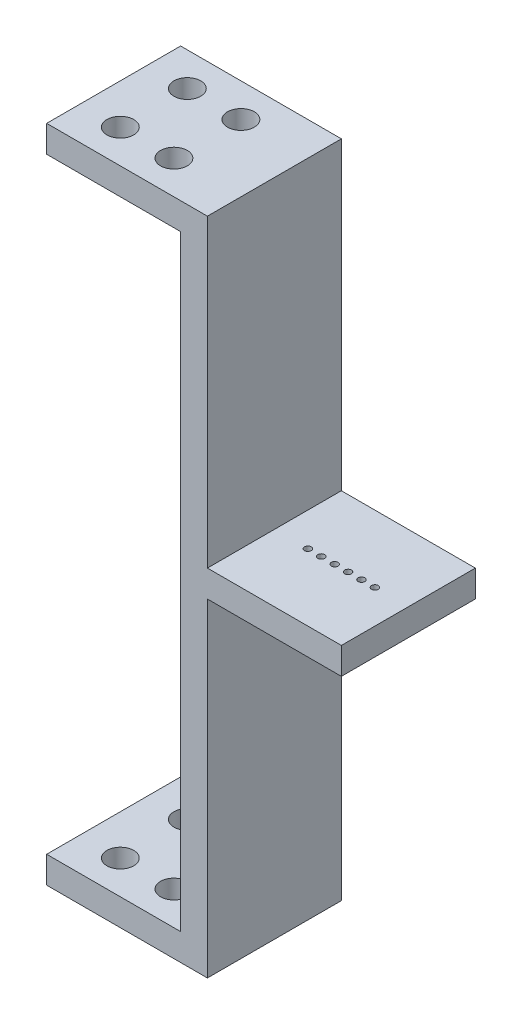
ISO-10303-21;
HEADER;
FILE_DESCRIPTION(('STEP AP214'),'2;1');
FILE_NAME('part.step','',(''),(''),'','','');
FILE_SCHEMA(('AUTOMOTIVE_DESIGN { 1 0 10303 214 1 1 1 1 }'));
ENDSEC;
DATA;
#1=APPLICATION_CONTEXT('core data for automotive mechanical design processes');
#2=APPLICATION_PROTOCOL_DEFINITION('international standard','automotive_design',2000,#1);
#3=PRODUCT_CONTEXT('',#1,'mechanical');
#4=PRODUCT('Part','Part','',(#3));
#5=PRODUCT_RELATED_PRODUCT_CATEGORY('part','',(#4));
#6=PRODUCT_DEFINITION_FORMATION('','',#4);
#7=PRODUCT_DEFINITION_CONTEXT('part definition',#1,'design');
#8=PRODUCT_DEFINITION('design','',#6,#7);
#9=PRODUCT_DEFINITION_SHAPE('','',#8);
#10=(LENGTH_UNIT() NAMED_UNIT(*) SI_UNIT(.MILLI.,.METRE.));
#11=(NAMED_UNIT(*) PLANE_ANGLE_UNIT() SI_UNIT($,.RADIAN.));
#12=(NAMED_UNIT(*) SI_UNIT($,.STERADIAN.) SOLID_ANGLE_UNIT());
#13=UNCERTAINTY_MEASURE_WITH_UNIT(LENGTH_MEASURE(1.E-05),#10,'distance_accuracy_value','');
#14=(GEOMETRIC_REPRESENTATION_CONTEXT(3) GLOBAL_UNCERTAINTY_ASSIGNED_CONTEXT((#13)) GLOBAL_UNIT_ASSIGNED_CONTEXT((#10,
#11,#12)) REPRESENTATION_CONTEXT('',''));
#15=CARTESIAN_POINT('',(0.,0.,0.));
#16=DIRECTION('',(0.,0.,1.));
#17=DIRECTION('',(1.,0.,0.));
#18=AXIS2_PLACEMENT_3D('',#15,#16,#17);
#19=CARTESIAN_POINT('',(-24.,49.25,20.));
#20=DIRECTION('',(1.,0.,0.));
#21=DIRECTION('',(0.,0.,-1.));
#22=AXIS2_PLACEMENT_3D('',#19,#20,#21);
#23=PLANE('',#22);
#24=DIRECTION('',(0.,-1.,0.));
#25=VECTOR('',#24,1.);
#26=CARTESIAN_POINT('',(-24.,49.25,0.));
#27=LINE('',#26,#25);
#28=CARTESIAN_POINT('',(-24.,49.25,0.));
#29=VERTEX_POINT('',#28);
#30=CARTESIAN_POINT('',(-24.,45.25,0.));
#31=VERTEX_POINT('',#30);
#32=EDGE_CURVE('E153',#29,#31,#27,.T.);
#33=ORIENTED_EDGE('',*,*,#32,.T.);
#34=DIRECTION('',(0.,0.,-1.));
#35=VECTOR('',#34,1.);
#36=CARTESIAN_POINT('',(-24.,45.25,20.));
#37=LINE('',#36,#35);
#38=CARTESIAN_POINT('',(-24.,45.25,20.));
#39=VERTEX_POINT('',#38);
#40=EDGE_CURVE('E11',#39,#31,#37,.T.);
#41=ORIENTED_EDGE('',*,*,#40,.F.);
#42=DIRECTION('',(0.,-1.,0.));
#43=VECTOR('',#42,1.);
#44=CARTESIAN_POINT('',(-24.,49.25,20.));
#45=LINE('',#44,#43);
#46=CARTESIAN_POINT('',(-24.,49.25,20.));
#47=VERTEX_POINT('',#46);
#48=EDGE_CURVE('E176',#47,#39,#45,.T.);
#49=ORIENTED_EDGE('',*,*,#48,.F.);
#50=DIRECTION('',(0.,0.,-1.));
#51=VECTOR('',#50,1.);
#52=CARTESIAN_POINT('',(-24.,49.25,20.));
#53=LINE('',#52,#51);
#54=EDGE_CURVE('E149',#47,#29,#53,.T.);
#55=ORIENTED_EDGE('',*,*,#54,.T.);
#56=EDGE_LOOP('',(#33,#41,#49,#55));
#57=FACE_BOUND('',#56,.T.);
#58=ADVANCED_FACE('F33',(#57),#23,.F.);
#59=CARTESIAN_POINT('',(-24.,45.25,20.));
#60=DIRECTION('',(0.,1.,0.));
#61=DIRECTION('',(0.,0.,1.));
#62=AXIS2_PLACEMENT_3D('',#59,#60,#61);
#63=PLANE('',#62);
#64=CARTESIAN_POINT('',(-18.,45.25,15.));
#65=DIRECTION('',(0.,1.,0.));
#66=DIRECTION('',(0.,0.,1.));
#67=AXIS2_PLACEMENT_3D('',#64,#65,#66);
#68=CIRCLE('',#67,2.);
#69=CARTESIAN_POINT('',(-18.,45.25,17.));
#70=VERTEX_POINT('',#69);
#71=EDGE_CURVE('E157',#70,#70,#68,.T.);
#72=ORIENTED_EDGE('',*,*,#71,.T.);
#73=EDGE_LOOP('',(#72));
#74=FACE_BOUND('',#73,.T.);
#75=CARTESIAN_POINT('',(-9.99999999999999,45.25,15.));
#76=DIRECTION('',(0.,1.,0.));
#77=DIRECTION('',(0.,0.,1.));
#78=AXIS2_PLACEMENT_3D('',#75,#76,#77);
#79=CIRCLE('',#78,2.);
#80=CARTESIAN_POINT('',(-9.99999999999999,45.25,17.));
#81=VERTEX_POINT('',#80);
#82=EDGE_CURVE('E376',#81,#81,#79,.T.);
#83=ORIENTED_EDGE('',*,*,#82,.T.);
#84=EDGE_LOOP('',(#83));
#85=FACE_BOUND('',#84,.T.);
#86=CARTESIAN_POINT('',(-9.99999999999999,45.25,5.));
#87=DIRECTION('',(0.,1.,0.));
#88=DIRECTION('',(0.,0.,1.));
#89=AXIS2_PLACEMENT_3D('',#86,#87,#88);
#90=CIRCLE('',#89,2.);
#91=CARTESIAN_POINT('',(-9.99999999999999,45.25,7.));
#92=VERTEX_POINT('',#91);
#93=EDGE_CURVE('E370',#92,#92,#90,.T.);
#94=ORIENTED_EDGE('',*,*,#93,.T.);
#95=EDGE_LOOP('',(#94));
#96=FACE_BOUND('',#95,.T.);
#97=CARTESIAN_POINT('',(-18.,45.25,5.));
#98=DIRECTION('',(0.,1.,0.));
#99=DIRECTION('',(0.,0.,1.));
#100=AXIS2_PLACEMENT_3D('',#97,#98,#99);
#101=CIRCLE('',#100,2.);
#102=CARTESIAN_POINT('',(-18.,45.25,7.));
#103=VERTEX_POINT('',#102);
#104=EDGE_CURVE('E364',#103,#103,#101,.T.);
#105=ORIENTED_EDGE('',*,*,#104,.T.);
#106=EDGE_LOOP('',(#105));
#107=FACE_BOUND('',#106,.T.);
#108=DIRECTION('',(1.,0.,0.));
#109=VECTOR('',#108,1.);
#110=CARTESIAN_POINT('',(-24.,45.25,0.));
#111=LINE('',#110,#109);
#112=CARTESIAN_POINT('',(-4.,45.25,0.));
#113=VERTEX_POINT('',#112);
#114=EDGE_CURVE('E156',#31,#113,#111,.T.);
#115=ORIENTED_EDGE('',*,*,#114,.T.);
#116=DIRECTION('',(0.,0.,-1.));
#117=VECTOR('',#116,1.);
#118=CARTESIAN_POINT('',(-4.,45.25,20.));
#119=LINE('',#118,#117);
#120=CARTESIAN_POINT('',(-4.,45.25,20.));
#121=VERTEX_POINT('',#120);
#122=EDGE_CURVE('E41',#121,#113,#119,.T.);
#123=ORIENTED_EDGE('',*,*,#122,.F.);
#124=DIRECTION('',(1.,0.,0.));
#125=VECTOR('',#124,1.);
#126=CARTESIAN_POINT('',(-24.,45.25,20.));
#127=LINE('',#126,#125);
#128=EDGE_CURVE('E104',#39,#121,#127,.T.);
#129=ORIENTED_EDGE('',*,*,#128,.F.);
#130=ORIENTED_EDGE('',*,*,#40,.T.);
#131=EDGE_LOOP('',(#115,#123,#129,#130));
#132=FACE_BOUND('',#131,.T.);
#133=ADVANCED_FACE('F257',(#74,#85,#96,#107,#132),#63,.F.);
#134=CARTESIAN_POINT('',(-4.,45.25,20.));
#135=DIRECTION('',(1.,0.,0.));
#136=DIRECTION('',(0.,1.,0.));
#137=AXIS2_PLACEMENT_3D('',#134,#135,#136);
#138=PLANE('',#137);
#139=DIRECTION('',(0.,-1.,0.));
#140=VECTOR('',#139,1.);
#141=CARTESIAN_POINT('',(-4.,45.25,0.));
#142=LINE('',#141,#140);
#143=CARTESIAN_POINT('',(-3.99999999999999,-45.25,0.));
#144=VERTEX_POINT('',#143);
#145=EDGE_CURVE('E159',#113,#144,#142,.T.);
#146=ORIENTED_EDGE('',*,*,#145,.T.);
#147=DIRECTION('',(0.,0.,-1.));
#148=VECTOR('',#147,1.);
#149=CARTESIAN_POINT('',(-3.99999999999999,-45.25,20.));
#150=LINE('',#149,#148);
#151=CARTESIAN_POINT('',(-3.99999999999999,-45.25,20.));
#152=VERTEX_POINT('',#151);
#153=EDGE_CURVE('E195',#152,#144,#150,.T.);
#154=ORIENTED_EDGE('',*,*,#153,.F.);
#155=DIRECTION('',(0.,-1.,0.));
#156=VECTOR('',#155,1.);
#157=CARTESIAN_POINT('',(-4.,45.25,20.));
#158=LINE('',#157,#156);
#159=EDGE_CURVE('E203',#121,#152,#158,.T.);
#160=ORIENTED_EDGE('',*,*,#159,.F.);
#161=ORIENTED_EDGE('',*,*,#122,.T.);
#162=EDGE_LOOP('',(#146,#154,#160,#161));
#163=FACE_BOUND('',#162,.T.);
#164=ADVANCED_FACE('F201',(#163),#138,.F.);
#165=CARTESIAN_POINT('',(-3.99999999999999,-45.25,20.));
#166=DIRECTION('',(0.,-1.,0.));
#167=DIRECTION('',(0.,0.,-1.));
#168=AXIS2_PLACEMENT_3D('',#165,#166,#167);
#169=PLANE('',#168);
#170=CARTESIAN_POINT('',(-18.,-45.25,15.));
#171=DIRECTION('',(0.,-1.,0.));
#172=DIRECTION('',(0.,0.,-1.));
#173=AXIS2_PLACEMENT_3D('',#170,#171,#172);
#174=CIRCLE('',#173,2.);
#175=CARTESIAN_POINT('',(-18.,-45.25,13.));
#176=VERTEX_POINT('',#175);
#177=EDGE_CURVE('E379',#176,#176,#174,.T.);
#178=ORIENTED_EDGE('',*,*,#177,.T.);
#179=EDGE_LOOP('',(#178));
#180=FACE_BOUND('',#179,.T.);
#181=CARTESIAN_POINT('',(-9.99999999999999,-45.25,15.));
#182=DIRECTION('',(0.,-1.,0.));
#183=DIRECTION('',(0.,0.,-1.));
#184=AXIS2_PLACEMENT_3D('',#181,#182,#183);
#185=CIRCLE('',#184,2.);
#186=CARTESIAN_POINT('',(-9.99999999999999,-45.25,13.));
#187=VERTEX_POINT('',#186);
#188=EDGE_CURVE('E373',#187,#187,#185,.T.);
#189=ORIENTED_EDGE('',*,*,#188,.T.);
#190=EDGE_LOOP('',(#189));
#191=FACE_BOUND('',#190,.T.);
#192=CARTESIAN_POINT('',(-9.99999999999999,-45.25,5.));
#193=DIRECTION('',(0.,-1.,0.));
#194=DIRECTION('',(0.,0.,-1.));
#195=AXIS2_PLACEMENT_3D('',#192,#193,#194);
#196=CIRCLE('',#195,2.);
#197=CARTESIAN_POINT('',(-9.99999999999999,-45.25,3.));
#198=VERTEX_POINT('',#197);
#199=EDGE_CURVE('E367',#198,#198,#196,.T.);
#200=ORIENTED_EDGE('',*,*,#199,.T.);
#201=EDGE_LOOP('',(#200));
#202=FACE_BOUND('',#201,.T.);
#203=CARTESIAN_POINT('',(-18.,-45.25,5.));
#204=DIRECTION('',(0.,-1.,0.));
#205=DIRECTION('',(0.,0.,-1.));
#206=AXIS2_PLACEMENT_3D('',#203,#204,#205);
#207=CIRCLE('',#206,2.);
#208=CARTESIAN_POINT('',(-18.,-45.25,3.));
#209=VERTEX_POINT('',#208);
#210=EDGE_CURVE('E359',#209,#209,#207,.T.);
#211=ORIENTED_EDGE('',*,*,#210,.T.);
#212=EDGE_LOOP('',(#211));
#213=FACE_BOUND('',#212,.T.);
#214=DIRECTION('',(-1.,0.,0.));
#215=VECTOR('',#214,1.);
#216=CARTESIAN_POINT('',(-3.99999999999999,-45.25,0.));
#217=LINE('',#216,#215);
#218=CARTESIAN_POINT('',(-24.,-45.25,0.));
#219=VERTEX_POINT('',#218);
#220=EDGE_CURVE('E161',#144,#219,#217,.T.);
#221=ORIENTED_EDGE('',*,*,#220,.T.);
#222=DIRECTION('',(0.,0.,-1.));
#223=VECTOR('',#222,1.);
#224=CARTESIAN_POINT('',(-24.,-45.25,20.));
#225=LINE('',#224,#223);
#226=CARTESIAN_POINT('',(-24.,-45.25,20.));
#227=VERTEX_POINT('',#226);
#228=EDGE_CURVE('E192',#227,#219,#225,.T.);
#229=ORIENTED_EDGE('',*,*,#228,.F.);
#230=DIRECTION('',(-1.,0.,0.));
#231=VECTOR('',#230,1.);
#232=CARTESIAN_POINT('',(-3.99999999999999,-45.25,20.));
#233=LINE('',#232,#231);
#234=EDGE_CURVE('E221',#152,#227,#233,.T.);
#235=ORIENTED_EDGE('',*,*,#234,.F.);
#236=ORIENTED_EDGE('',*,*,#153,.T.);
#237=EDGE_LOOP('',(#221,#229,#235,#236));
#238=FACE_BOUND('',#237,.T.);
#239=ADVANCED_FACE('F212',(#180,#191,#202,#213,#238),#169,.F.);
#240=CARTESIAN_POINT('',(-24.,-49.25,20.));
#241=DIRECTION('',(1.,0.,0.));
#242=DIRECTION('',(0.,0.,-1.));
#243=AXIS2_PLACEMENT_3D('',#240,#241,#242);
#244=PLANE('',#243);
#245=DIRECTION('',(0.,-1.,0.));
#246=VECTOR('',#245,1.);
#247=CARTESIAN_POINT('',(-24.,-49.25,0.));
#248=LINE('',#247,#246);
#249=CARTESIAN_POINT('',(-24.,-49.25,0.));
#250=VERTEX_POINT('',#249);
#251=EDGE_CURVE('E163',#219,#250,#248,.T.);
#252=ORIENTED_EDGE('',*,*,#251,.T.);
#253=DIRECTION('',(0.,0.,-1.));
#254=VECTOR('',#253,1.);
#255=CARTESIAN_POINT('',(-24.,-49.25,20.));
#256=LINE('',#255,#254);
#257=CARTESIAN_POINT('',(-24.,-49.25,20.));
#258=VERTEX_POINT('',#257);
#259=EDGE_CURVE('E189',#258,#250,#256,.T.);
#260=ORIENTED_EDGE('',*,*,#259,.F.);
#261=DIRECTION('',(0.,-1.,0.));
#262=VECTOR('',#261,1.);
#263=CARTESIAN_POINT('',(-24.,-49.25,20.));
#264=LINE('',#263,#262);
#265=EDGE_CURVE('E218',#227,#258,#264,.T.);
#266=ORIENTED_EDGE('',*,*,#265,.F.);
#267=ORIENTED_EDGE('',*,*,#228,.T.);
#268=EDGE_LOOP('',(#252,#260,#266,#267));
#269=FACE_BOUND('',#268,.T.);
#270=ADVANCED_FACE('F216',(#269),#244,.F.);
#271=CARTESIAN_POINT('',(0.,-49.25,20.));
#272=DIRECTION('',(0.,1.,0.));
#273=DIRECTION('',(0.,0.,1.));
#274=AXIS2_PLACEMENT_3D('',#271,#272,#273);
#275=PLANE('',#274);
#276=CARTESIAN_POINT('',(-18.,-49.25,15.));
#277=DIRECTION('',(0.,1.,0.));
#278=DIRECTION('',(0.,0.,1.));
#279=AXIS2_PLACEMENT_3D('',#276,#277,#278);
#280=CIRCLE('',#279,2.);
#281=CARTESIAN_POINT('',(-18.,-49.25,17.));
#282=VERTEX_POINT('',#281);
#283=EDGE_CURVE('E337',#282,#282,#280,.T.);
#284=ORIENTED_EDGE('',*,*,#283,.T.);
#285=EDGE_LOOP('',(#284));
#286=FACE_BOUND('',#285,.T.);
#287=CARTESIAN_POINT('',(-9.99999999999999,-49.25,15.));
#288=DIRECTION('',(0.,1.,0.));
#289=DIRECTION('',(0.,0.,1.));
#290=AXIS2_PLACEMENT_3D('',#287,#288,#289);
#291=CIRCLE('',#290,2.);
#292=CARTESIAN_POINT('',(-9.99999999999999,-49.25,17.));
#293=VERTEX_POINT('',#292);
#294=EDGE_CURVE('E348',#293,#293,#291,.T.);
#295=ORIENTED_EDGE('',*,*,#294,.T.);
#296=EDGE_LOOP('',(#295));
#297=FACE_BOUND('',#296,.T.);
#298=CARTESIAN_POINT('',(-9.99999999999999,-49.25,5.));
#299=DIRECTION('',(0.,1.,0.));
#300=DIRECTION('',(0.,0.,1.));
#301=AXIS2_PLACEMENT_3D('',#298,#299,#300);
#302=CIRCLE('',#301,2.);
#303=CARTESIAN_POINT('',(-9.99999999999999,-49.25,7.));
#304=VERTEX_POINT('',#303);
#305=EDGE_CURVE('E342',#304,#304,#302,.T.);
#306=ORIENTED_EDGE('',*,*,#305,.T.);
#307=EDGE_LOOP('',(#306));
#308=FACE_BOUND('',#307,.T.);
#309=CARTESIAN_POINT('',(-18.,-49.25,5.));
#310=DIRECTION('',(0.,1.,0.));
#311=DIRECTION('',(0.,0.,1.));
#312=AXIS2_PLACEMENT_3D('',#309,#310,#311);
#313=CIRCLE('',#312,2.);
#314=CARTESIAN_POINT('',(-18.,-49.25,7.));
#315=VERTEX_POINT('',#314);
#316=EDGE_CURVE('E356',#315,#315,#313,.T.);
#317=ORIENTED_EDGE('',*,*,#316,.T.);
#318=EDGE_LOOP('',(#317));
#319=FACE_BOUND('',#318,.T.);
#320=DIRECTION('',(1.,0.,0.));
#321=VECTOR('',#320,1.);
#322=CARTESIAN_POINT('',(0.,-49.25,0.));
#323=LINE('',#322,#321);
#324=CARTESIAN_POINT('',(0.,-49.25,0.));
#325=VERTEX_POINT('',#324);
#326=EDGE_CURVE('E165',#250,#325,#323,.T.);
#327=ORIENTED_EDGE('',*,*,#326,.T.);
#328=DIRECTION('',(0.,0.,-1.));
#329=VECTOR('',#328,1.);
#330=CARTESIAN_POINT('',(0.,-49.25,20.));
#331=LINE('',#330,#329);
#332=CARTESIAN_POINT('',(0.,-49.25,20.));
#333=VERTEX_POINT('',#332);
#334=EDGE_CURVE('E186',#333,#325,#331,.T.);
#335=ORIENTED_EDGE('',*,*,#334,.F.);
#336=DIRECTION('',(1.,0.,0.));
#337=VECTOR('',#336,1.);
#338=CARTESIAN_POINT('',(0.,-49.25,20.));
#339=LINE('',#338,#337);
#340=EDGE_CURVE('E220',#258,#333,#339,.T.);
#341=ORIENTED_EDGE('',*,*,#340,.F.);
#342=ORIENTED_EDGE('',*,*,#259,.T.);
#343=EDGE_LOOP('',(#327,#335,#341,#342));
#344=FACE_BOUND('',#343,.T.);
#345=ADVANCED_FACE('F274',(#286,#297,#308,#319,#344),#275,.F.);
#346=CARTESIAN_POINT('',(0.,-0.25,20.));
#347=DIRECTION('',(-1.,0.,0.));
#348=DIRECTION('',(0.,-1.,0.));
#349=AXIS2_PLACEMENT_3D('',#346,#347,#348);
#350=PLANE('',#349);
#351=DIRECTION('',(0.,1.,0.));
#352=VECTOR('',#351,1.);
#353=CARTESIAN_POINT('',(0.,-0.25,0.));
#354=LINE('',#353,#352);
#355=CARTESIAN_POINT('',(0.,-0.25,0.));
#356=VERTEX_POINT('',#355);
#357=EDGE_CURVE('E167',#325,#356,#354,.T.);
#358=ORIENTED_EDGE('',*,*,#357,.T.);
#359=DIRECTION('',(0.,0.,-1.));
#360=VECTOR('',#359,1.);
#361=CARTESIAN_POINT('',(0.,-0.25,20.));
#362=LINE('',#361,#360);
#363=CARTESIAN_POINT('',(0.,-0.25,20.));
#364=VERTEX_POINT('',#363);
#365=EDGE_CURVE('E183',#364,#356,#362,.T.);
#366=ORIENTED_EDGE('',*,*,#365,.F.);
#367=DIRECTION('',(0.,1.,0.));
#368=VECTOR('',#367,1.);
#369=CARTESIAN_POINT('',(0.,-0.25,20.));
#370=LINE('',#369,#368);
#371=EDGE_CURVE('E223',#333,#364,#370,.T.);
#372=ORIENTED_EDGE('',*,*,#371,.F.);
#373=ORIENTED_EDGE('',*,*,#334,.T.);
#374=EDGE_LOOP('',(#358,#366,#372,#373));
#375=FACE_BOUND('',#374,.T.);
#376=ADVANCED_FACE('F277',(#375),#350,.F.);
#377=CARTESIAN_POINT('',(20.,-0.249999999999997,20.));
#378=DIRECTION('',(0.,1.,0.));
#379=DIRECTION('',(-1.,0.,0.));
#380=AXIS2_PLACEMENT_3D('',#377,#378,#379);
#381=PLANE('',#380);
#382=CARTESIAN_POINT('',(15.,-0.249999999999997,10.));
#383=DIRECTION('',(0.,1.,0.));
#384=DIRECTION('',(-1.,0.,0.));
#385=AXIS2_PLACEMENT_3D('',#382,#383,#384);
#386=CIRCLE('',#385,0.499999999999999);
#387=CARTESIAN_POINT('',(14.5,-0.249999999999997,10.));
#388=VERTEX_POINT('',#387);
#389=EDGE_CURVE('E334',#388,#388,#386,.T.);
#390=ORIENTED_EDGE('',*,*,#389,.T.);
#391=EDGE_LOOP('',(#390));
#392=FACE_BOUND('',#391,.T.);
#393=CARTESIAN_POINT('',(13.,-0.249999999999997,10.));
#394=DIRECTION('',(0.,1.,0.));
#395=DIRECTION('',(-1.,0.,0.));
#396=AXIS2_PLACEMENT_3D('',#393,#394,#395);
#397=CIRCLE('',#396,0.499999999999999);
#398=CARTESIAN_POINT('',(12.5,-0.249999999999997,10.));
#399=VERTEX_POINT('',#398);
#400=EDGE_CURVE('E331',#399,#399,#397,.T.);
#401=ORIENTED_EDGE('',*,*,#400,.T.);
#402=EDGE_LOOP('',(#401));
#403=FACE_BOUND('',#402,.T.);
#404=CARTESIAN_POINT('',(11.,-0.249999999999997,10.));
#405=DIRECTION('',(0.,1.,0.));
#406=DIRECTION('',(-1.,0.,0.));
#407=AXIS2_PLACEMENT_3D('',#404,#405,#406);
#408=CIRCLE('',#407,0.499999999999999);
#409=CARTESIAN_POINT('',(10.5,-0.249999999999997,10.));
#410=VERTEX_POINT('',#409);
#411=EDGE_CURVE('E328',#410,#410,#408,.T.);
#412=ORIENTED_EDGE('',*,*,#411,.T.);
#413=EDGE_LOOP('',(#412));
#414=FACE_BOUND('',#413,.T.);
#415=CARTESIAN_POINT('',(9.00000000000001,-0.249999999999997,10.));
#416=DIRECTION('',(0.,1.,0.));
#417=DIRECTION('',(-1.,0.,0.));
#418=AXIS2_PLACEMENT_3D('',#415,#416,#417);
#419=CIRCLE('',#418,0.499999999999999);
#420=CARTESIAN_POINT('',(8.50000000000001,-0.249999999999997,10.));
#421=VERTEX_POINT('',#420);
#422=EDGE_CURVE('E325',#421,#421,#419,.T.);
#423=ORIENTED_EDGE('',*,*,#422,.T.);
#424=EDGE_LOOP('',(#423));
#425=FACE_BOUND('',#424,.T.);
#426=CARTESIAN_POINT('',(7.00000000000001,-0.249999999999997,10.0000000000001));
#427=DIRECTION('',(0.,1.,0.));
#428=DIRECTION('',(-1.,0.,0.));
#429=AXIS2_PLACEMENT_3D('',#426,#427,#428);
#430=CIRCLE('',#429,0.499999999999999);
#431=CARTESIAN_POINT('',(6.50000000000001,-0.249999999999997,10.0000000000001));
#432=VERTEX_POINT('',#431);
#433=EDGE_CURVE('E322',#432,#432,#430,.T.);
#434=ORIENTED_EDGE('',*,*,#433,.T.);
#435=EDGE_LOOP('',(#434));
#436=FACE_BOUND('',#435,.T.);
#437=CARTESIAN_POINT('',(5.00000000000001,-0.25,10.0000000000001));
#438=DIRECTION('',(0.,1.,0.));
#439=DIRECTION('',(-1.,0.,0.));
#440=AXIS2_PLACEMENT_3D('',#437,#438,#439);
#441=CIRCLE('',#440,0.499999999999999);
#442=CARTESIAN_POINT('',(4.50000000000001,-0.25,10.0000000000001));
#443=VERTEX_POINT('',#442);
#444=EDGE_CURVE('E319',#443,#443,#441,.T.);
#445=ORIENTED_EDGE('',*,*,#444,.T.);
#446=EDGE_LOOP('',(#445));
#447=FACE_BOUND('',#446,.T.);
#448=DIRECTION('',(1.,0.,0.));
#449=VECTOR('',#448,1.);
#450=CARTESIAN_POINT('',(20.,-0.249999999999997,0.));
#451=LINE('',#450,#449);
#452=CARTESIAN_POINT('',(20.,-0.249999999999997,0.));
#453=VERTEX_POINT('',#452);
#454=EDGE_CURVE('E169',#356,#453,#451,.T.);
#455=ORIENTED_EDGE('',*,*,#454,.T.);
#456=DIRECTION('',(0.,0.,-1.));
#457=VECTOR('',#456,1.);
#458=CARTESIAN_POINT('',(20.,-0.249999999999997,20.));
#459=LINE('',#458,#457);
#460=CARTESIAN_POINT('',(20.,-0.249999999999997,20.));
#461=VERTEX_POINT('',#460);
#462=EDGE_CURVE('E180',#461,#453,#459,.T.);
#463=ORIENTED_EDGE('',*,*,#462,.F.);
#464=DIRECTION('',(1.,0.,0.));
#465=VECTOR('',#464,1.);
#466=CARTESIAN_POINT('',(20.,-0.249999999999997,20.));
#467=LINE('',#466,#465);
#468=EDGE_CURVE('E229',#364,#461,#467,.T.);
#469=ORIENTED_EDGE('',*,*,#468,.F.);
#470=ORIENTED_EDGE('',*,*,#365,.T.);
#471=EDGE_LOOP('',(#455,#463,#469,#470));
#472=FACE_BOUND('',#471,.T.);
#473=ADVANCED_FACE('F235',(#392,#403,#414,#425,#436,#447,#472),#381,.F.);
#474=CARTESIAN_POINT('',(20.,3.75,20.));
#475=DIRECTION('',(-1.,0.,0.));
#476=DIRECTION('',(0.,0.,1.));
#477=AXIS2_PLACEMENT_3D('',#474,#475,#476);
#478=PLANE('',#477);
#479=DIRECTION('',(0.,1.,0.));
#480=VECTOR('',#479,1.);
#481=CARTESIAN_POINT('',(20.,3.75,0.));
#482=LINE('',#481,#480);
#483=CARTESIAN_POINT('',(20.,3.75,0.));
#484=VERTEX_POINT('',#483);
#485=EDGE_CURVE('E171',#453,#484,#482,.T.);
#486=ORIENTED_EDGE('',*,*,#485,.T.);
#487=DIRECTION('',(0.,0.,-1.));
#488=VECTOR('',#487,1.);
#489=CARTESIAN_POINT('',(20.,3.75,20.));
#490=LINE('',#489,#488);
#491=CARTESIAN_POINT('',(20.,3.75,20.));
#492=VERTEX_POINT('',#491);
#493=EDGE_CURVE('E144',#492,#484,#490,.T.);
#494=ORIENTED_EDGE('',*,*,#493,.F.);
#495=DIRECTION('',(0.,1.,0.));
#496=VECTOR('',#495,1.);
#497=CARTESIAN_POINT('',(20.,3.75,20.));
#498=LINE('',#497,#496);
#499=EDGE_CURVE('E135',#461,#492,#498,.T.);
#500=ORIENTED_EDGE('',*,*,#499,.F.);
#501=ORIENTED_EDGE('',*,*,#462,.T.);
#502=EDGE_LOOP('',(#486,#494,#500,#501));
#503=FACE_BOUND('',#502,.T.);
#504=ADVANCED_FACE('F239',(#503),#478,.F.);
#505=CARTESIAN_POINT('',(0.,3.75,20.));
#506=DIRECTION('',(0.,-1.,0.));
#507=DIRECTION('',(0.,0.,-1.));
#508=AXIS2_PLACEMENT_3D('',#505,#506,#507);
#509=PLANE('',#508);
#510=CARTESIAN_POINT('',(15.,3.75,10.));
#511=DIRECTION('',(0.,1.,0.));
#512=DIRECTION('',(0.,0.,1.));
#513=AXIS2_PLACEMENT_3D('',#510,#511,#512);
#514=CIRCLE('',#513,0.499999999999999);
#515=CARTESIAN_POINT('',(15.,3.75,10.5));
#516=VERTEX_POINT('',#515);
#517=EDGE_CURVE('E294',#516,#516,#514,.T.);
#518=ORIENTED_EDGE('',*,*,#517,.F.);
#519=EDGE_LOOP('',(#518));
#520=FACE_BOUND('',#519,.T.);
#521=CARTESIAN_POINT('',(13.,3.75,10.));
#522=DIRECTION('',(0.,1.,0.));
#523=DIRECTION('',(0.,0.,1.));
#524=AXIS2_PLACEMENT_3D('',#521,#522,#523);
#525=CIRCLE('',#524,0.499999999999999);
#526=CARTESIAN_POINT('',(13.,3.75,10.5));
#527=VERTEX_POINT('',#526);
#528=EDGE_CURVE('E298',#527,#527,#525,.T.);
#529=ORIENTED_EDGE('',*,*,#528,.F.);
#530=EDGE_LOOP('',(#529));
#531=FACE_BOUND('',#530,.T.);
#532=CARTESIAN_POINT('',(11.,3.75,10.));
#533=DIRECTION('',(0.,1.,0.));
#534=DIRECTION('',(0.,0.,1.));
#535=AXIS2_PLACEMENT_3D('',#532,#533,#534);
#536=CIRCLE('',#535,0.499999999999999);
#537=CARTESIAN_POINT('',(11.,3.75,10.5));
#538=VERTEX_POINT('',#537);
#539=EDGE_CURVE('E302',#538,#538,#536,.T.);
#540=ORIENTED_EDGE('',*,*,#539,.F.);
#541=EDGE_LOOP('',(#540));
#542=FACE_BOUND('',#541,.T.);
#543=CARTESIAN_POINT('',(9.00000000000001,3.75,10.));
#544=DIRECTION('',(0.,1.,0.));
#545=DIRECTION('',(0.,0.,1.));
#546=AXIS2_PLACEMENT_3D('',#543,#544,#545);
#547=CIRCLE('',#546,0.499999999999999);
#548=CARTESIAN_POINT('',(9.00000000000001,3.75,10.5));
#549=VERTEX_POINT('',#548);
#550=EDGE_CURVE('E306',#549,#549,#547,.T.);
#551=ORIENTED_EDGE('',*,*,#550,.F.);
#552=EDGE_LOOP('',(#551));
#553=FACE_BOUND('',#552,.T.);
#554=CARTESIAN_POINT('',(7.00000000000001,3.75,10.0000000000001));
#555=DIRECTION('',(0.,1.,0.));
#556=DIRECTION('',(0.,0.,1.));
#557=AXIS2_PLACEMENT_3D('',#554,#555,#556);
#558=CIRCLE('',#557,0.499999999999999);
#559=CARTESIAN_POINT('',(7.00000000000001,3.75,10.5000000000001));
#560=VERTEX_POINT('',#559);
#561=EDGE_CURVE('E310',#560,#560,#558,.T.);
#562=ORIENTED_EDGE('',*,*,#561,.F.);
#563=EDGE_LOOP('',(#562));
#564=FACE_BOUND('',#563,.T.);
#565=CARTESIAN_POINT('',(5.00000000000001,3.75,10.0000000000001));
#566=DIRECTION('',(0.,1.,0.));
#567=DIRECTION('',(0.,0.,1.));
#568=AXIS2_PLACEMENT_3D('',#565,#566,#567);
#569=CIRCLE('',#568,0.499999999999999);
#570=CARTESIAN_POINT('',(5.00000000000001,3.75,10.5000000000001));
#571=VERTEX_POINT('',#570);
#572=EDGE_CURVE('E313',#571,#571,#569,.T.);
#573=ORIENTED_EDGE('',*,*,#572,.F.);
#574=EDGE_LOOP('',(#573));
#575=FACE_BOUND('',#574,.T.);
#576=DIRECTION('',(-1.,0.,0.));
#577=VECTOR('',#576,1.);
#578=CARTESIAN_POINT('',(0.,3.75,0.));
#579=LINE('',#578,#577);
#580=CARTESIAN_POINT('',(0.,3.75,0.));
#581=VERTEX_POINT('',#580);
#582=EDGE_CURVE('E143',#484,#581,#579,.T.);
#583=ORIENTED_EDGE('',*,*,#582,.T.);
#584=DIRECTION('',(0.,0.,-1.));
#585=VECTOR('',#584,1.);
#586=CARTESIAN_POINT('',(0.,3.75,20.));
#587=LINE('',#586,#585);
#588=CARTESIAN_POINT('',(0.,3.75,20.));
#589=VERTEX_POINT('',#588);
#590=EDGE_CURVE('E140',#589,#581,#587,.T.);
#591=ORIENTED_EDGE('',*,*,#590,.F.);
#592=DIRECTION('',(-1.,0.,0.));
#593=VECTOR('',#592,1.);
#594=CARTESIAN_POINT('',(0.,3.75,20.));
#595=LINE('',#594,#593);
#596=EDGE_CURVE('E129',#492,#589,#595,.T.);
#597=ORIENTED_EDGE('',*,*,#596,.F.);
#598=ORIENTED_EDGE('',*,*,#493,.T.);
#599=EDGE_LOOP('',(#583,#591,#597,#598));
#600=FACE_BOUND('',#599,.T.);
#601=ADVANCED_FACE('F141',(#520,#531,#542,#553,#564,#575,#600),#509,.F.);
#602=CARTESIAN_POINT('',(0.,49.25,20.));
#603=DIRECTION('',(-1.,0.,0.));
#604=DIRECTION('',(0.,-1.,0.));
#605=AXIS2_PLACEMENT_3D('',#602,#603,#604);
#606=PLANE('',#605);
#607=DIRECTION('',(0.,1.,0.));
#608=VECTOR('',#607,1.);
#609=CARTESIAN_POINT('',(0.,49.25,0.));
#610=LINE('',#609,#608);
#611=CARTESIAN_POINT('',(0.,49.25,0.));
#612=VERTEX_POINT('',#611);
#613=EDGE_CURVE('E90',#581,#612,#610,.T.);
#614=ORIENTED_EDGE('',*,*,#613,.T.);
#615=DIRECTION('',(0.,0.,-1.));
#616=VECTOR('',#615,1.);
#617=CARTESIAN_POINT('',(0.,49.25,20.));
#618=LINE('',#617,#616);
#619=CARTESIAN_POINT('',(0.,49.25,20.));
#620=VERTEX_POINT('',#619);
#621=EDGE_CURVE('E145',#620,#612,#618,.T.);
#622=ORIENTED_EDGE('',*,*,#621,.F.);
#623=DIRECTION('',(0.,1.,0.));
#624=VECTOR('',#623,1.);
#625=CARTESIAN_POINT('',(0.,49.25,20.));
#626=LINE('',#625,#624);
#627=EDGE_CURVE('E133',#589,#620,#626,.T.);
#628=ORIENTED_EDGE('',*,*,#627,.F.);
#629=ORIENTED_EDGE('',*,*,#590,.T.);
#630=EDGE_LOOP('',(#614,#622,#628,#629));
#631=FACE_BOUND('',#630,.T.);
#632=ADVANCED_FACE('F147',(#631),#606,.F.);
#633=CARTESIAN_POINT('',(-24.,49.25,20.));
#634=DIRECTION('',(0.,-1.,0.));
#635=DIRECTION('',(0.,0.,-1.));
#636=AXIS2_PLACEMENT_3D('',#633,#634,#635);
#637=PLANE('',#636);
#638=CARTESIAN_POINT('',(-18.,49.25,15.));
#639=DIRECTION('',(0.,1.,0.));
#640=DIRECTION('',(0.,0.,1.));
#641=AXIS2_PLACEMENT_3D('',#638,#639,#640);
#642=CIRCLE('',#641,2.);
#643=CARTESIAN_POINT('',(-18.,49.25,17.));
#644=VERTEX_POINT('',#643);
#645=EDGE_CURVE('E351',#644,#644,#642,.T.);
#646=ORIENTED_EDGE('',*,*,#645,.F.);
#647=EDGE_LOOP('',(#646));
#648=FACE_BOUND('',#647,.T.);
#649=CARTESIAN_POINT('',(-9.99999999999999,49.25,15.));
#650=DIRECTION('',(0.,1.,0.));
#651=DIRECTION('',(0.,0.,1.));
#652=AXIS2_PLACEMENT_3D('',#649,#650,#651);
#653=CIRCLE('',#652,2.);
#654=CARTESIAN_POINT('',(-9.99999999999999,49.25,17.));
#655=VERTEX_POINT('',#654);
#656=EDGE_CURVE('E345',#655,#655,#653,.T.);
#657=ORIENTED_EDGE('',*,*,#656,.F.);
#658=EDGE_LOOP('',(#657));
#659=FACE_BOUND('',#658,.T.);
#660=CARTESIAN_POINT('',(-9.99999999999999,49.25,5.));
#661=DIRECTION('',(0.,1.,0.));
#662=DIRECTION('',(0.,0.,1.));
#663=AXIS2_PLACEMENT_3D('',#660,#661,#662);
#664=CIRCLE('',#663,2.);
#665=CARTESIAN_POINT('',(-9.99999999999999,49.25,7.));
#666=VERTEX_POINT('',#665);
#667=EDGE_CURVE('E338',#666,#666,#664,.T.);
#668=ORIENTED_EDGE('',*,*,#667,.F.);
#669=EDGE_LOOP('',(#668));
#670=FACE_BOUND('',#669,.T.);
#671=CARTESIAN_POINT('',(-18.,49.25,5.));
#672=DIRECTION('',(0.,1.,0.));
#673=DIRECTION('',(0.,0.,1.));
#674=AXIS2_PLACEMENT_3D('',#671,#672,#673);
#675=CIRCLE('',#674,2.);
#676=CARTESIAN_POINT('',(-18.,49.25,7.));
#677=VERTEX_POINT('',#676);
#678=EDGE_CURVE('E341',#677,#677,#675,.T.);
#679=ORIENTED_EDGE('',*,*,#678,.F.);
#680=EDGE_LOOP('',(#679));
#681=FACE_BOUND('',#680,.T.);
#682=DIRECTION('',(-1.,0.,0.));
#683=VECTOR('',#682,1.);
#684=CARTESIAN_POINT('',(-24.,49.25,0.));
#685=LINE('',#684,#683);
#686=EDGE_CURVE('E96',#612,#29,#685,.T.);
#687=ORIENTED_EDGE('',*,*,#686,.T.);
#688=ORIENTED_EDGE('',*,*,#54,.F.);
#689=DIRECTION('',(-1.,0.,0.));
#690=VECTOR('',#689,1.);
#691=CARTESIAN_POINT('',(-24.,49.25,20.));
#692=LINE('',#691,#690);
#693=EDGE_CURVE('E49',#620,#47,#692,.T.);
#694=ORIENTED_EDGE('',*,*,#693,.F.);
#695=ORIENTED_EDGE('',*,*,#621,.T.);
#696=EDGE_LOOP('',(#687,#688,#694,#695));
#697=FACE_BOUND('',#696,.T.);
#698=ADVANCED_FACE('F243',(#648,#659,#670,#681,#697),#637,.F.);
#699=CARTESIAN_POINT('',(0.,0.,20.));
#700=DIRECTION('',(0.,0.,1.));
#701=DIRECTION('',(1.,0.,0.));
#702=AXIS2_PLACEMENT_3D('',#699,#700,#701);
#703=PLANE('',#702);
#704=ORIENTED_EDGE('',*,*,#48,.T.);
#705=ORIENTED_EDGE('',*,*,#128,.T.);
#706=ORIENTED_EDGE('',*,*,#159,.T.);
#707=ORIENTED_EDGE('',*,*,#234,.T.);
#708=ORIENTED_EDGE('',*,*,#265,.T.);
#709=ORIENTED_EDGE('',*,*,#340,.T.);
#710=ORIENTED_EDGE('',*,*,#371,.T.);
#711=ORIENTED_EDGE('',*,*,#468,.T.);
#712=ORIENTED_EDGE('',*,*,#499,.T.);
#713=ORIENTED_EDGE('',*,*,#596,.T.);
#714=ORIENTED_EDGE('',*,*,#627,.T.);
#715=ORIENTED_EDGE('',*,*,#693,.T.);
#716=EDGE_LOOP('',(#704,#705,#706,#707,#708,#709,#710,#711,#712,#713,#714,#715));
#717=FACE_BOUND('',#716,.T.);
#718=ADVANCED_FACE('F131',(#717),#703,.T.);
#719=CARTESIAN_POINT('',(0.,0.,0.));
#720=DIRECTION('',(0.,0.,1.));
#721=DIRECTION('',(1.,0.,0.));
#722=AXIS2_PLACEMENT_3D('',#719,#720,#721);
#723=PLANE('',#722);
#724=ORIENTED_EDGE('',*,*,#32,.F.);
#725=ORIENTED_EDGE('',*,*,#686,.F.);
#726=ORIENTED_EDGE('',*,*,#613,.F.);
#727=ORIENTED_EDGE('',*,*,#582,.F.);
#728=ORIENTED_EDGE('',*,*,#485,.F.);
#729=ORIENTED_EDGE('',*,*,#454,.F.);
#730=ORIENTED_EDGE('',*,*,#357,.F.);
#731=ORIENTED_EDGE('',*,*,#326,.F.);
#732=ORIENTED_EDGE('',*,*,#251,.F.);
#733=ORIENTED_EDGE('',*,*,#220,.F.);
#734=ORIENTED_EDGE('',*,*,#145,.F.);
#735=ORIENTED_EDGE('',*,*,#114,.F.);
#736=EDGE_LOOP('',(#724,#725,#726,#727,#728,#729,#730,#731,#732,#733,#734,#735));
#737=FACE_BOUND('',#736,.T.);
#738=ADVANCED_FACE('F207',(#737),#723,.F.);
#739=CARTESIAN_POINT('',(-18.,-49.25,5.));
#740=DIRECTION('',(0.,1.,0.));
#741=DIRECTION('',(0.,0.,1.));
#742=AXIS2_PLACEMENT_3D('',#739,#740,#741);
#743=CYLINDRICAL_SURFACE('',#742,2.);
#744=ORIENTED_EDGE('',*,*,#678,.T.);
#745=EDGE_LOOP('',(#744));
#746=FACE_BOUND('',#745,.T.);
#747=ORIENTED_EDGE('',*,*,#104,.F.);
#748=EDGE_LOOP('',(#747));
#749=FACE_BOUND('',#748,.T.);
#750=ADVANCED_FACE('F400',(#746,#749),#743,.F.);
#751=CARTESIAN_POINT('',(-9.99999999999999,-49.25,5.));
#752=DIRECTION('',(0.,1.,0.));
#753=DIRECTION('',(0.,0.,1.));
#754=AXIS2_PLACEMENT_3D('',#751,#752,#753);
#755=CYLINDRICAL_SURFACE('',#754,2.);
#756=ORIENTED_EDGE('',*,*,#667,.T.);
#757=EDGE_LOOP('',(#756));
#758=FACE_BOUND('',#757,.T.);
#759=ORIENTED_EDGE('',*,*,#93,.F.);
#760=EDGE_LOOP('',(#759));
#761=FACE_BOUND('',#760,.T.);
#762=ADVANCED_FACE('F401',(#758,#761),#755,.F.);
#763=CARTESIAN_POINT('',(-9.99999999999999,-49.25,15.));
#764=DIRECTION('',(0.,1.,0.));
#765=DIRECTION('',(0.,0.,1.));
#766=AXIS2_PLACEMENT_3D('',#763,#764,#765);
#767=CYLINDRICAL_SURFACE('',#766,2.);
#768=ORIENTED_EDGE('',*,*,#656,.T.);
#769=EDGE_LOOP('',(#768));
#770=FACE_BOUND('',#769,.T.);
#771=ORIENTED_EDGE('',*,*,#82,.F.);
#772=EDGE_LOOP('',(#771));
#773=FACE_BOUND('',#772,.T.);
#774=ADVANCED_FACE('F389',(#770,#773),#767,.F.);
#775=CARTESIAN_POINT('',(-18.,-49.25,15.));
#776=DIRECTION('',(0.,1.,0.));
#777=DIRECTION('',(0.,0.,1.));
#778=AXIS2_PLACEMENT_3D('',#775,#776,#777);
#779=CYLINDRICAL_SURFACE('',#778,2.);
#780=ORIENTED_EDGE('',*,*,#645,.T.);
#781=EDGE_LOOP('',(#780));
#782=FACE_BOUND('',#781,.T.);
#783=ORIENTED_EDGE('',*,*,#71,.F.);
#784=EDGE_LOOP('',(#783));
#785=FACE_BOUND('',#784,.T.);
#786=ADVANCED_FACE('F386',(#782,#785),#779,.F.);
#787=ORIENTED_EDGE('',*,*,#316,.F.);
#788=EDGE_LOOP('',(#787));
#789=FACE_BOUND('',#788,.T.);
#790=ORIENTED_EDGE('',*,*,#210,.F.);
#791=EDGE_LOOP('',(#790));
#792=FACE_BOUND('',#791,.T.);
#793=ADVANCED_FACE('F388',(#789,#792),#743,.F.);
#794=ORIENTED_EDGE('',*,*,#305,.F.);
#795=EDGE_LOOP('',(#794));
#796=FACE_BOUND('',#795,.T.);
#797=ORIENTED_EDGE('',*,*,#199,.F.);
#798=EDGE_LOOP('',(#797));
#799=FACE_BOUND('',#798,.T.);
#800=ADVANCED_FACE('F397',(#796,#799),#755,.F.);
#801=ORIENTED_EDGE('',*,*,#294,.F.);
#802=EDGE_LOOP('',(#801));
#803=FACE_BOUND('',#802,.T.);
#804=ORIENTED_EDGE('',*,*,#188,.F.);
#805=EDGE_LOOP('',(#804));
#806=FACE_BOUND('',#805,.T.);
#807=ADVANCED_FACE('F404',(#803,#806),#767,.F.);
#808=ORIENTED_EDGE('',*,*,#283,.F.);
#809=EDGE_LOOP('',(#808));
#810=FACE_BOUND('',#809,.T.);
#811=ORIENTED_EDGE('',*,*,#177,.F.);
#812=EDGE_LOOP('',(#811));
#813=FACE_BOUND('',#812,.T.);
#814=ADVANCED_FACE('F392',(#810,#813),#779,.F.);
#815=CARTESIAN_POINT('',(5.00000000000001,-16.25,10.0000000000001));
#816=DIRECTION('',(0.,1.,0.));
#817=DIRECTION('',(0.,0.,1.));
#818=AXIS2_PLACEMENT_3D('',#815,#816,#817);
#819=CYLINDRICAL_SURFACE('',#818,0.499999999999999);
#820=ORIENTED_EDGE('',*,*,#572,.T.);
#821=EDGE_LOOP('',(#820));
#822=FACE_BOUND('',#821,.T.);
#823=ORIENTED_EDGE('',*,*,#444,.F.);
#824=EDGE_LOOP('',(#823));
#825=FACE_BOUND('',#824,.T.);
#826=ADVANCED_FACE('F406',(#822,#825),#819,.F.);
#827=CARTESIAN_POINT('',(7.00000000000001,-16.25,10.0000000000001));
#828=DIRECTION('',(0.,1.,0.));
#829=DIRECTION('',(0.,0.,1.));
#830=AXIS2_PLACEMENT_3D('',#827,#828,#829);
#831=CYLINDRICAL_SURFACE('',#830,0.499999999999999);
#832=ORIENTED_EDGE('',*,*,#561,.T.);
#833=EDGE_LOOP('',(#832));
#834=FACE_BOUND('',#833,.T.);
#835=ORIENTED_EDGE('',*,*,#433,.F.);
#836=EDGE_LOOP('',(#835));
#837=FACE_BOUND('',#836,.T.);
#838=ADVANCED_FACE('F412',(#834,#837),#831,.F.);
#839=CARTESIAN_POINT('',(9.00000000000001,-16.25,10.));
#840=DIRECTION('',(0.,1.,0.));
#841=DIRECTION('',(0.,0.,1.));
#842=AXIS2_PLACEMENT_3D('',#839,#840,#841);
#843=CYLINDRICAL_SURFACE('',#842,0.499999999999999);
#844=ORIENTED_EDGE('',*,*,#550,.T.);
#845=EDGE_LOOP('',(#844));
#846=FACE_BOUND('',#845,.T.);
#847=ORIENTED_EDGE('',*,*,#422,.F.);
#848=EDGE_LOOP('',(#847));
#849=FACE_BOUND('',#848,.T.);
#850=ADVANCED_FACE('F574',(#846,#849),#843,.F.);
#851=CARTESIAN_POINT('',(11.,-16.25,10.));
#852=DIRECTION('',(0.,1.,0.));
#853=DIRECTION('',(0.,0.,1.));
#854=AXIS2_PLACEMENT_3D('',#851,#852,#853);
#855=CYLINDRICAL_SURFACE('',#854,0.499999999999999);
#856=ORIENTED_EDGE('',*,*,#539,.T.);
#857=EDGE_LOOP('',(#856));
#858=FACE_BOUND('',#857,.T.);
#859=ORIENTED_EDGE('',*,*,#411,.F.);
#860=EDGE_LOOP('',(#859));
#861=FACE_BOUND('',#860,.T.);
#862=ADVANCED_FACE('F584',(#858,#861),#855,.F.);
#863=CARTESIAN_POINT('',(13.,-16.25,10.));
#864=DIRECTION('',(0.,1.,0.));
#865=DIRECTION('',(0.,0.,1.));
#866=AXIS2_PLACEMENT_3D('',#863,#864,#865);
#867=CYLINDRICAL_SURFACE('',#866,0.499999999999999);
#868=ORIENTED_EDGE('',*,*,#528,.T.);
#869=EDGE_LOOP('',(#868));
#870=FACE_BOUND('',#869,.T.);
#871=ORIENTED_EDGE('',*,*,#400,.F.);
#872=EDGE_LOOP('',(#871));
#873=FACE_BOUND('',#872,.T.);
#874=ADVANCED_FACE('F594',(#870,#873),#867,.F.);
#875=CARTESIAN_POINT('',(15.,-16.25,10.));
#876=DIRECTION('',(0.,1.,0.));
#877=DIRECTION('',(0.,0.,1.));
#878=AXIS2_PLACEMENT_3D('',#875,#876,#877);
#879=CYLINDRICAL_SURFACE('',#878,0.499999999999999);
#880=ORIENTED_EDGE('',*,*,#517,.T.);
#881=EDGE_LOOP('',(#880));
#882=FACE_BOUND('',#881,.T.);
#883=ORIENTED_EDGE('',*,*,#389,.F.);
#884=EDGE_LOOP('',(#883));
#885=FACE_BOUND('',#884,.T.);
#886=ADVANCED_FACE('F604',(#882,#885),#879,.F.);
#887=CLOSED_SHELL('',(#58,#133,#164,#239,#270,#345,#376,#473,#504,#601,#632,#698,#718,#738,#750,
#762,#774,#786,#793,#800,#807,#814,#826,#838,#850,#862,#874,#886));
#888=MANIFOLD_SOLID_BREP('B2',#887);
#889=ADVANCED_BREP_SHAPE_REPRESENTATION('',(#18,#888),#14);
#890=SHAPE_DEFINITION_REPRESENTATION(#9,#889);
ENDSEC;
END-ISO-10303-21;
